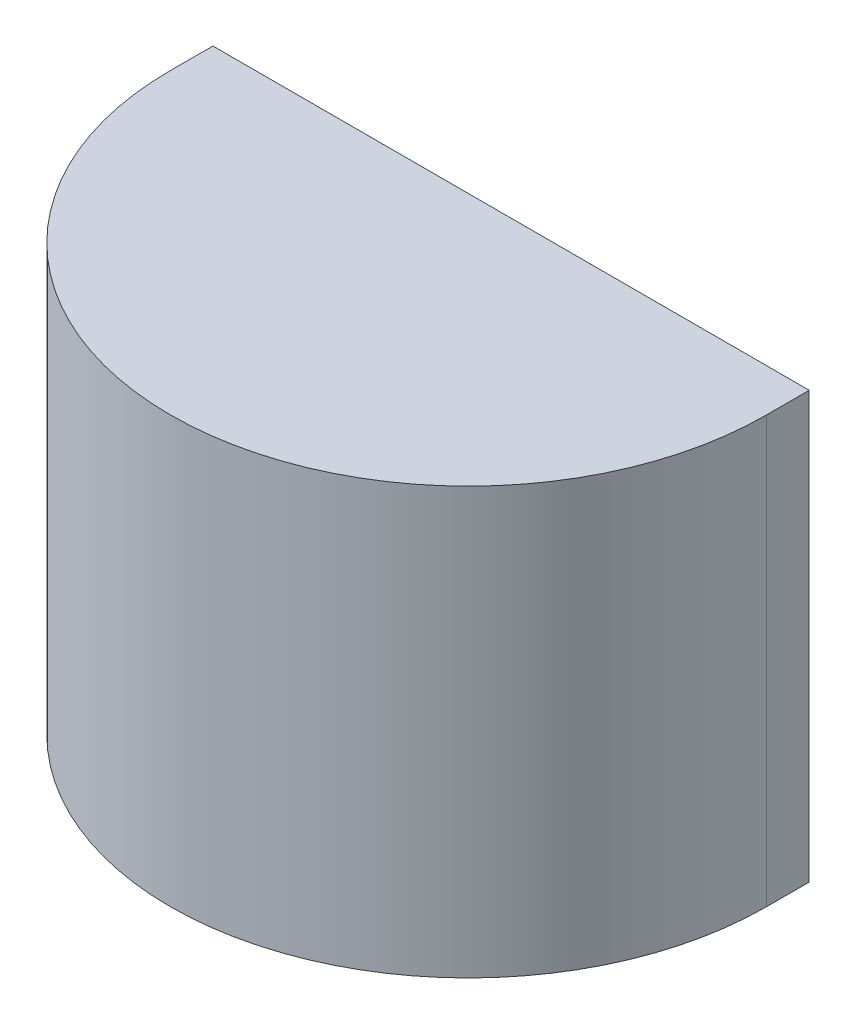
ISO-10303-21;
HEADER;
FILE_DESCRIPTION(('STEP AP214'),'2;1');
FILE_NAME('part.step','',(''),(''),'','','');
FILE_SCHEMA(('AUTOMOTIVE_DESIGN { 1 0 10303 214 1 1 1 1 }'));
ENDSEC;
DATA;
#1=APPLICATION_CONTEXT('core data for automotive mechanical design processes');
#2=APPLICATION_PROTOCOL_DEFINITION('international standard','automotive_design',2000,#1);
#3=PRODUCT_CONTEXT('',#1,'mechanical');
#4=PRODUCT('Part','Part','',(#3));
#5=PRODUCT_RELATED_PRODUCT_CATEGORY('part','',(#4));
#6=PRODUCT_DEFINITION_FORMATION('','',#4);
#7=PRODUCT_DEFINITION_CONTEXT('part definition',#1,'design');
#8=PRODUCT_DEFINITION('design','',#6,#7);
#9=PRODUCT_DEFINITION_SHAPE('','',#8);
#10=(LENGTH_UNIT() NAMED_UNIT(*) SI_UNIT(.MILLI.,.METRE.));
#11=(NAMED_UNIT(*) PLANE_ANGLE_UNIT() SI_UNIT($,.RADIAN.));
#12=(NAMED_UNIT(*) SI_UNIT($,.STERADIAN.) SOLID_ANGLE_UNIT());
#13=UNCERTAINTY_MEASURE_WITH_UNIT(LENGTH_MEASURE(1.E-05),#10,'distance_accuracy_value','');
#14=(GEOMETRIC_REPRESENTATION_CONTEXT(3) GLOBAL_UNCERTAINTY_ASSIGNED_CONTEXT((#13)) GLOBAL_UNIT_ASSIGNED_CONTEXT((#10,
#11,#12)) REPRESENTATION_CONTEXT('',''));
#15=CARTESIAN_POINT('',(0.,0.,0.));
#16=DIRECTION('',(0.,0.,1.));
#17=DIRECTION('',(1.,0.,0.));
#18=AXIS2_PLACEMENT_3D('',#15,#16,#17);
#19=CARTESIAN_POINT('',(0.,0.,6.35));
#20=DIRECTION('',(0.,0.,-1.));
#21=DIRECTION('',(-1.,0.,0.));
#22=AXIS2_PLACEMENT_3D('',#19,#20,#21);
#23=PLANE('',#22);
#24=CARTESIAN_POINT('',(31.75,0.,6.35));
#25=DIRECTION('',(0.,0.,1.));
#26=DIRECTION('',(1.,0.,0.));
#27=AXIS2_PLACEMENT_3D('',#24,#25,#26);
#28=CIRCLE('',#27,4.3561);
#29=CARTESIAN_POINT('',(36.1061,0.,6.35));
#30=VERTEX_POINT('',#29);
#31=EDGE_CURVE('E211',#30,#30,#28,.T.);
#32=ORIENTED_EDGE('',*,*,#31,.F.);
#33=EDGE_LOOP('',(#32));
#34=FACE_BOUND('',#33,.T.);
#35=CARTESIAN_POINT('',(-31.75,0.,6.35));
#36=DIRECTION('',(0.,0.,1.));
#37=DIRECTION('',(1.,0.,0.));
#38=AXIS2_PLACEMENT_3D('',#35,#36,#37);
#39=CIRCLE('',#38,4.3561);
#40=CARTESIAN_POINT('',(-27.3939,0.,6.35));
#41=VERTEX_POINT('',#40);
#42=EDGE_CURVE('E219',#41,#41,#39,.T.);
#43=ORIENTED_EDGE('',*,*,#42,.F.);
#44=EDGE_LOOP('',(#43));
#45=FACE_BOUND('',#44,.T.);
#46=DIRECTION('',(0.,1.,0.));
#47=VECTOR('',#46,1.);
#48=CARTESIAN_POINT('',(38.1,-44.45,6.35000000000001));
#49=LINE('',#48,#47);
#50=CARTESIAN_POINT('',(38.1,-12.7,6.35000000000001));
#51=VERTEX_POINT('',#50);
#52=CARTESIAN_POINT('',(38.1,12.7,6.35000000000001));
#53=VERTEX_POINT('',#52);
#54=EDGE_CURVE('E182',#51,#53,#49,.T.);
#55=ORIENTED_EDGE('',*,*,#54,.T.);
#56=DIRECTION('',(-1.,0.,0.));
#57=VECTOR('',#56,1.);
#58=CARTESIAN_POINT('',(-44.45,12.7,6.35));
#59=LINE('',#58,#57);
#60=CARTESIAN_POINT('',(-38.1,12.7,6.35));
#61=VERTEX_POINT('',#60);
#62=EDGE_CURVE('E229',#53,#61,#59,.T.);
#63=ORIENTED_EDGE('',*,*,#62,.T.);
#64=DIRECTION('',(0.,1.,0.));
#65=VECTOR('',#64,1.);
#66=CARTESIAN_POINT('',(-38.1,-44.45,6.35));
#67=LINE('',#66,#65);
#68=CARTESIAN_POINT('',(-38.1,-12.7,6.35));
#69=VERTEX_POINT('',#68);
#70=EDGE_CURVE('E145',#69,#61,#67,.T.);
#71=ORIENTED_EDGE('',*,*,#70,.F.);
#72=DIRECTION('',(1.,0.,0.));
#73=VECTOR('',#72,1.);
#74=CARTESIAN_POINT('',(-44.45,-12.7,6.35));
#75=LINE('',#74,#73);
#76=EDGE_CURVE('E11',#69,#51,#75,.T.);
#77=ORIENTED_EDGE('',*,*,#76,.T.);
#78=EDGE_LOOP('',(#55,#63,#71,#77));
#79=FACE_BOUND('',#78,.T.);
#80=ADVANCED_FACE('F45',(#34,#45,#79),#23,.F.);
#81=CARTESIAN_POINT('',(-44.45,-12.7,6.35));
#82=DIRECTION('',(0.,1.,0.));
#83=DIRECTION('',(0.,0.,1.));
#84=AXIS2_PLACEMENT_3D('',#81,#82,#83);
#85=PLANE('',#84);
#86=DIRECTION('',(0.,0.,-1.));
#87=VECTOR('',#86,1.);
#88=CARTESIAN_POINT('',(38.1,-12.7,6.35));
#89=LINE('',#88,#87);
#90=CARTESIAN_POINT('',(38.1,-12.7,0.));
#91=VERTEX_POINT('',#90);
#92=EDGE_CURVE('E191',#51,#91,#89,.T.);
#93=ORIENTED_EDGE('',*,*,#92,.F.);
#94=ORIENTED_EDGE('',*,*,#76,.F.);
#95=DIRECTION('',(0.,0.,-1.));
#96=VECTOR('',#95,1.);
#97=CARTESIAN_POINT('',(-38.1,-12.7,6.35));
#98=LINE('',#97,#96);
#99=CARTESIAN_POINT('',(-38.1,-12.7,0.));
#100=VERTEX_POINT('',#99);
#101=EDGE_CURVE('E140',#69,#100,#98,.T.);
#102=ORIENTED_EDGE('',*,*,#101,.T.);
#103=DIRECTION('',(1.,0.,0.));
#104=VECTOR('',#103,1.);
#105=CARTESIAN_POINT('',(-44.45,-12.7,0.));
#106=LINE('',#105,#104);
#107=EDGE_CURVE('E49',#100,#91,#106,.T.);
#108=ORIENTED_EDGE('',*,*,#107,.T.);
#109=EDGE_LOOP('',(#93,#94,#102,#108));
#110=FACE_BOUND('',#109,.T.);
#111=ADVANCED_FACE('F244',(#110),#85,.F.);
#112=CARTESIAN_POINT('',(0.,12.7,0.));
#113=DIRECTION('',(0.,1.,0.));
#114=DIRECTION('',(0.,0.,1.));
#115=AXIS2_PLACEMENT_3D('',#112,#113,#114);
#116=PLANE('',#115);
#117=CARTESIAN_POINT('',(0.,12.7,6.35));
#118=DIRECTION('',(0.,1.,0.));
#119=DIRECTION('',(0.,0.,1.));
#120=AXIS2_PLACEMENT_3D('',#117,#118,#119);
#121=CIRCLE('',#120,38.1);
#122=EDGE_CURVE('E194',#61,#53,#121,.T.);
#123=ORIENTED_EDGE('',*,*,#122,.F.);
#124=ORIENTED_EDGE('',*,*,#62,.F.);
#125=EDGE_LOOP('',(#123,#124));
#126=FACE_BOUND('',#125,.T.);
#127=ADVANCED_FACE('F280',(#126),#116,.F.);
#128=CARTESIAN_POINT('',(0.,0.,0.));
#129=DIRECTION('',(0.,0.,-1.));
#130=DIRECTION('',(-1.,0.,0.));
#131=AXIS2_PLACEMENT_3D('',#128,#129,#130);
#132=PLANE('',#131);
#133=DIRECTION('',(0.,1.,0.));
#134=VECTOR('',#133,1.);
#135=CARTESIAN_POINT('',(38.1,-44.45,0.));
#136=LINE('',#135,#134);
#137=CARTESIAN_POINT('',(38.1,-44.45,0.));
#138=VERTEX_POINT('',#137);
#139=EDGE_CURVE('E183',#138,#91,#136,.T.);
#140=ORIENTED_EDGE('',*,*,#139,.T.);
#141=ORIENTED_EDGE('',*,*,#107,.F.);
#142=DIRECTION('',(0.,1.,0.));
#143=VECTOR('',#142,1.);
#144=CARTESIAN_POINT('',(-38.1,-44.45,0.));
#145=LINE('',#144,#143);
#146=CARTESIAN_POINT('',(-38.1,-44.45,0.));
#147=VERTEX_POINT('',#146);
#148=EDGE_CURVE('E144',#147,#100,#145,.T.);
#149=ORIENTED_EDGE('',*,*,#148,.F.);
#150=DIRECTION('',(-1.,0.,0.));
#151=VECTOR('',#150,1.);
#152=CARTESIAN_POINT('',(0.,-44.45,0.));
#153=LINE('',#152,#151);
#154=CARTESIAN_POINT('',(-44.45,-44.45,0.));
#155=VERTEX_POINT('',#154);
#156=EDGE_CURVE('E160',#147,#155,#153,.T.);
#157=ORIENTED_EDGE('',*,*,#156,.T.);
#158=DIRECTION('',(0.,-1.,0.));
#159=VECTOR('',#158,1.);
#160=CARTESIAN_POINT('',(-44.45,-12.7,0.));
#161=LINE('',#160,#159);
#162=CARTESIAN_POINT('',(-44.45,19.05,0.));
#163=VERTEX_POINT('',#162);
#164=EDGE_CURVE('E236',#163,#155,#161,.T.);
#165=ORIENTED_EDGE('',*,*,#164,.F.);
#166=DIRECTION('',(-1.,0.,0.));
#167=VECTOR('',#166,1.);
#168=CARTESIAN_POINT('',(0.,19.05,0.));
#169=LINE('',#168,#167);
#170=CARTESIAN_POINT('',(44.45,19.05,0.));
#171=VERTEX_POINT('',#170);
#172=EDGE_CURVE('E201',#171,#163,#169,.T.);
#173=ORIENTED_EDGE('',*,*,#172,.F.);
#174=DIRECTION('',(0.,1.,0.));
#175=VECTOR('',#174,1.);
#176=CARTESIAN_POINT('',(44.45,-12.7,0.));
#177=LINE('',#176,#175);
#178=CARTESIAN_POINT('',(44.45,-44.45,0.));
#179=VERTEX_POINT('',#178);
#180=EDGE_CURVE('E223',#179,#171,#177,.T.);
#181=ORIENTED_EDGE('',*,*,#180,.F.);
#182=EDGE_CURVE('E166',#179,#138,#153,.T.);
#183=ORIENTED_EDGE('',*,*,#182,.T.);
#184=EDGE_LOOP('',(#140,#141,#149,#157,#165,#173,#181,#183));
#185=FACE_BOUND('',#184,.T.);
#186=CARTESIAN_POINT('',(-31.75,0.,0.));
#187=DIRECTION('',(0.,0.,1.));
#188=DIRECTION('',(1.,0.,0.));
#189=AXIS2_PLACEMENT_3D('',#186,#187,#188);
#190=CIRCLE('',#189,4.3561);
#191=CARTESIAN_POINT('',(-27.3939,0.,0.));
#192=VERTEX_POINT('',#191);
#193=EDGE_CURVE('E215',#192,#192,#190,.T.);
#194=ORIENTED_EDGE('',*,*,#193,.T.);
#195=EDGE_LOOP('',(#194));
#196=FACE_BOUND('',#195,.T.);
#197=CARTESIAN_POINT('',(31.75,0.,0.));
#198=DIRECTION('',(0.,0.,1.));
#199=DIRECTION('',(1.,0.,0.));
#200=AXIS2_PLACEMENT_3D('',#197,#198,#199);
#201=CIRCLE('',#200,4.3561);
#202=CARTESIAN_POINT('',(36.1061,0.,0.));
#203=VERTEX_POINT('',#202);
#204=EDGE_CURVE('E210',#203,#203,#201,.T.);
#205=ORIENTED_EDGE('',*,*,#204,.T.);
#206=EDGE_LOOP('',(#205));
#207=FACE_BOUND('',#206,.T.);
#208=ADVANCED_FACE('F247',(#185,#196,#207),#132,.T.);
#209=CARTESIAN_POINT('',(44.45,-12.7,6.35));
#210=DIRECTION('',(-1.,0.,0.));
#211=DIRECTION('',(0.,0.,1.));
#212=AXIS2_PLACEMENT_3D('',#209,#210,#211);
#213=PLANE('',#212);
#214=ORIENTED_EDGE('',*,*,#180,.T.);
#215=DIRECTION('',(0.,0.,-1.));
#216=VECTOR('',#215,1.);
#217=CARTESIAN_POINT('',(44.45,19.05,0.));
#218=LINE('',#217,#216);
#219=CARTESIAN_POINT('',(44.45,19.05,6.35));
#220=VERTEX_POINT('',#219);
#221=EDGE_CURVE('E197',#220,#171,#218,.T.);
#222=ORIENTED_EDGE('',*,*,#221,.F.);
#223=DIRECTION('',(0.,1.,0.));
#224=VECTOR('',#223,1.);
#225=CARTESIAN_POINT('',(44.45,-12.7,6.35));
#226=LINE('',#225,#224);
#227=CARTESIAN_POINT('',(44.45,-44.45,6.35));
#228=VERTEX_POINT('',#227);
#229=EDGE_CURVE('E63',#228,#220,#226,.T.);
#230=ORIENTED_EDGE('',*,*,#229,.F.);
#231=DIRECTION('',(0.,0.,-1.));
#232=VECTOR('',#231,1.);
#233=CARTESIAN_POINT('',(44.45,-44.45,0.));
#234=LINE('',#233,#232);
#235=EDGE_CURVE('E173',#228,#179,#234,.T.);
#236=ORIENTED_EDGE('',*,*,#235,.T.);
#237=EDGE_LOOP('',(#214,#222,#230,#236));
#238=FACE_BOUND('',#237,.T.);
#239=ADVANCED_FACE('F47',(#238),#213,.F.);
#240=CARTESIAN_POINT('',(-44.45,-12.7,6.35));
#241=DIRECTION('',(1.,0.,0.));
#242=DIRECTION('',(0.,0.,-1.));
#243=AXIS2_PLACEMENT_3D('',#240,#241,#242);
#244=PLANE('',#243);
#245=ORIENTED_EDGE('',*,*,#164,.T.);
#246=DIRECTION('',(0.,0.,1.));
#247=VECTOR('',#246,1.);
#248=CARTESIAN_POINT('',(-44.45,-44.45,0.));
#249=LINE('',#248,#247);
#250=CARTESIAN_POINT('',(-44.45,-44.45,6.34999999999999));
#251=VERTEX_POINT('',#250);
#252=EDGE_CURVE('E164',#155,#251,#249,.T.);
#253=ORIENTED_EDGE('',*,*,#252,.T.);
#254=DIRECTION('',(0.,-1.,0.));
#255=VECTOR('',#254,1.);
#256=CARTESIAN_POINT('',(-44.45,-12.7,6.35));
#257=LINE('',#256,#255);
#258=CARTESIAN_POINT('',(-44.45,19.05,6.35));
#259=VERTEX_POINT('',#258);
#260=EDGE_CURVE('E55',#259,#251,#257,.T.);
#261=ORIENTED_EDGE('',*,*,#260,.F.);
#262=DIRECTION('',(0.,0.,1.));
#263=VECTOR('',#262,1.);
#264=CARTESIAN_POINT('',(-44.45,19.05,0.));
#265=LINE('',#264,#263);
#266=EDGE_CURVE('E204',#163,#259,#265,.T.);
#267=ORIENTED_EDGE('',*,*,#266,.F.);
#268=EDGE_LOOP('',(#245,#253,#261,#267));
#269=FACE_BOUND('',#268,.T.);
#270=ADVANCED_FACE('F263',(#269),#244,.F.);
#271=CARTESIAN_POINT('',(-31.75,0.,6.35));
#272=DIRECTION('',(0.,0.,-1.));
#273=DIRECTION('',(-1.,0.,0.));
#274=AXIS2_PLACEMENT_3D('',#271,#272,#273);
#275=CYLINDRICAL_SURFACE('',#274,4.3561);
#276=ORIENTED_EDGE('',*,*,#42,.T.);
#277=EDGE_LOOP('',(#276));
#278=FACE_BOUND('',#277,.T.);
#279=ORIENTED_EDGE('',*,*,#193,.F.);
#280=EDGE_LOOP('',(#279));
#281=FACE_BOUND('',#280,.T.);
#282=ADVANCED_FACE('F265',(#278,#281),#275,.F.);
#283=CARTESIAN_POINT('',(31.75,0.,6.35));
#284=DIRECTION('',(0.,0.,-1.));
#285=DIRECTION('',(-1.,0.,0.));
#286=AXIS2_PLACEMENT_3D('',#283,#284,#285);
#287=CYLINDRICAL_SURFACE('',#286,4.3561);
#288=ORIENTED_EDGE('',*,*,#31,.T.);
#289=EDGE_LOOP('',(#288));
#290=FACE_BOUND('',#289,.T.);
#291=ORIENTED_EDGE('',*,*,#204,.F.);
#292=EDGE_LOOP('',(#291));
#293=FACE_BOUND('',#292,.T.);
#294=ADVANCED_FACE('F270',(#290,#293),#287,.F.);
#295=CARTESIAN_POINT('',(0.,19.05,6.35));
#296=DIRECTION('',(0.,-1.,0.));
#297=DIRECTION('',(0.,0.,-1.));
#298=AXIS2_PLACEMENT_3D('',#295,#296,#297);
#299=CYLINDRICAL_SURFACE('',#298,44.45);
#300=CARTESIAN_POINT('',(0.,19.05,6.35));
#301=DIRECTION('',(0.,1.,0.));
#302=DIRECTION('',(0.,0.,1.));
#303=AXIS2_PLACEMENT_3D('',#300,#301,#302);
#304=CIRCLE('',#303,44.45);
#305=EDGE_CURVE('E207',#259,#220,#304,.T.);
#306=ORIENTED_EDGE('',*,*,#305,.F.);
#307=ORIENTED_EDGE('',*,*,#260,.T.);
#308=CARTESIAN_POINT('',(0.,-44.45,6.35));
#309=DIRECTION('',(0.,1.,0.));
#310=DIRECTION('',(0.,0.,1.));
#311=AXIS2_PLACEMENT_3D('',#308,#309,#310);
#312=CIRCLE('',#311,44.45);
#313=EDGE_CURVE('E170',#251,#228,#312,.T.);
#314=ORIENTED_EDGE('',*,*,#313,.T.);
#315=ORIENTED_EDGE('',*,*,#229,.T.);
#316=EDGE_LOOP('',(#306,#307,#314,#315));
#317=FACE_BOUND('',#316,.T.);
#318=ADVANCED_FACE('F262',(#317),#299,.T.);
#319=CARTESIAN_POINT('',(0.,19.05,0.));
#320=DIRECTION('',(0.,1.,0.));
#321=DIRECTION('',(0.,0.,1.));
#322=AXIS2_PLACEMENT_3D('',#319,#320,#321);
#323=PLANE('',#322);
#324=ORIENTED_EDGE('',*,*,#172,.T.);
#325=ORIENTED_EDGE('',*,*,#266,.T.);
#326=ORIENTED_EDGE('',*,*,#305,.T.);
#327=ORIENTED_EDGE('',*,*,#221,.T.);
#328=EDGE_LOOP('',(#324,#325,#326,#327));
#329=FACE_BOUND('',#328,.T.);
#330=ADVANCED_FACE('F261',(#329),#323,.T.);
#331=CARTESIAN_POINT('',(0.,-44.45,6.35));
#332=DIRECTION('',(0.,1.,0.));
#333=DIRECTION('',(0.,0.,1.));
#334=AXIS2_PLACEMENT_3D('',#331,#332,#333);
#335=CYLINDRICAL_SURFACE('',#334,38.1);
#336=ORIENTED_EDGE('',*,*,#70,.T.);
#337=ORIENTED_EDGE('',*,*,#122,.T.);
#338=ORIENTED_EDGE('',*,*,#54,.F.);
#339=CARTESIAN_POINT('',(38.1,-44.45,6.35000000000001));
#340=VERTEX_POINT('',#339);
#341=EDGE_CURVE('E152',#340,#51,#49,.T.);
#342=ORIENTED_EDGE('',*,*,#341,.F.);
#343=CARTESIAN_POINT('',(0.,-44.45,6.35));
#344=DIRECTION('',(0.,1.,0.));
#345=DIRECTION('',(0.,0.,1.));
#346=AXIS2_PLACEMENT_3D('',#343,#344,#345);
#347=CIRCLE('',#346,38.1);
#348=CARTESIAN_POINT('',(-38.1,-44.45,6.35));
#349=VERTEX_POINT('',#348);
#350=EDGE_CURVE('E149',#349,#340,#347,.T.);
#351=ORIENTED_EDGE('',*,*,#350,.F.);
#352=EDGE_CURVE('E134',#349,#69,#67,.T.);
#353=ORIENTED_EDGE('',*,*,#352,.T.);
#354=EDGE_LOOP('',(#336,#337,#338,#342,#351,#353));
#355=FACE_BOUND('',#354,.T.);
#356=ADVANCED_FACE('F150',(#355),#335,.F.);
#357=CARTESIAN_POINT('',(38.1,-44.45,0.));
#358=DIRECTION('',(1.,0.,0.));
#359=DIRECTION('',(0.,0.,-1.));
#360=AXIS2_PLACEMENT_3D('',#357,#358,#359);
#361=PLANE('',#360);
#362=ORIENTED_EDGE('',*,*,#341,.T.);
#363=ORIENTED_EDGE('',*,*,#92,.T.);
#364=ORIENTED_EDGE('',*,*,#139,.F.);
#365=DIRECTION('',(0.,0.,-1.));
#366=VECTOR('',#365,1.);
#367=CARTESIAN_POINT('',(38.1,-44.45,0.));
#368=LINE('',#367,#366);
#369=EDGE_CURVE('E177',#340,#138,#368,.T.);
#370=ORIENTED_EDGE('',*,*,#369,.F.);
#371=EDGE_LOOP('',(#362,#363,#364,#370));
#372=FACE_BOUND('',#371,.T.);
#373=ADVANCED_FACE('F253',(#372),#361,.F.);
#374=CARTESIAN_POINT('',(-38.1,-44.45,0.));
#375=DIRECTION('',(1.,0.,0.));
#376=DIRECTION('',(0.,0.,-1.));
#377=AXIS2_PLACEMENT_3D('',#374,#375,#376);
#378=PLANE('',#377);
#379=ORIENTED_EDGE('',*,*,#101,.F.);
#380=ORIENTED_EDGE('',*,*,#352,.F.);
#381=DIRECTION('',(0.,0.,-1.));
#382=VECTOR('',#381,1.);
#383=CARTESIAN_POINT('',(-38.1,-44.45,0.));
#384=LINE('',#383,#382);
#385=EDGE_CURVE('E138',#349,#147,#384,.T.);
#386=ORIENTED_EDGE('',*,*,#385,.T.);
#387=ORIENTED_EDGE('',*,*,#148,.T.);
#388=EDGE_LOOP('',(#379,#380,#386,#387));
#389=FACE_BOUND('',#388,.T.);
#390=ADVANCED_FACE('F136',(#389),#378,.T.);
#391=CARTESIAN_POINT('',(0.,-44.45,0.));
#392=DIRECTION('',(0.,1.,0.));
#393=DIRECTION('',(0.,0.,1.));
#394=AXIS2_PLACEMENT_3D('',#391,#392,#393);
#395=PLANE('',#394);
#396=ORIENTED_EDGE('',*,*,#350,.T.);
#397=ORIENTED_EDGE('',*,*,#369,.T.);
#398=ORIENTED_EDGE('',*,*,#182,.F.);
#399=ORIENTED_EDGE('',*,*,#235,.F.);
#400=ORIENTED_EDGE('',*,*,#313,.F.);
#401=ORIENTED_EDGE('',*,*,#252,.F.);
#402=ORIENTED_EDGE('',*,*,#156,.F.);
#403=ORIENTED_EDGE('',*,*,#385,.F.);
#404=EDGE_LOOP('',(#396,#397,#398,#399,#400,#401,#402,#403));
#405=FACE_BOUND('',#404,.T.);
#406=ADVANCED_FACE('F157',(#405),#395,.F.);
#407=CLOSED_SHELL('',(#80,#111,#127,#208,#239,#270,#282,#294,#318,#330,#356,#373,#390,#406));
#408=MANIFOLD_SOLID_BREP('B2',#407);
#409=ADVANCED_BREP_SHAPE_REPRESENTATION('',(#18,#408),#14);
#410=SHAPE_DEFINITION_REPRESENTATION(#9,#409);
ENDSEC;
END-ISO-10303-21;
